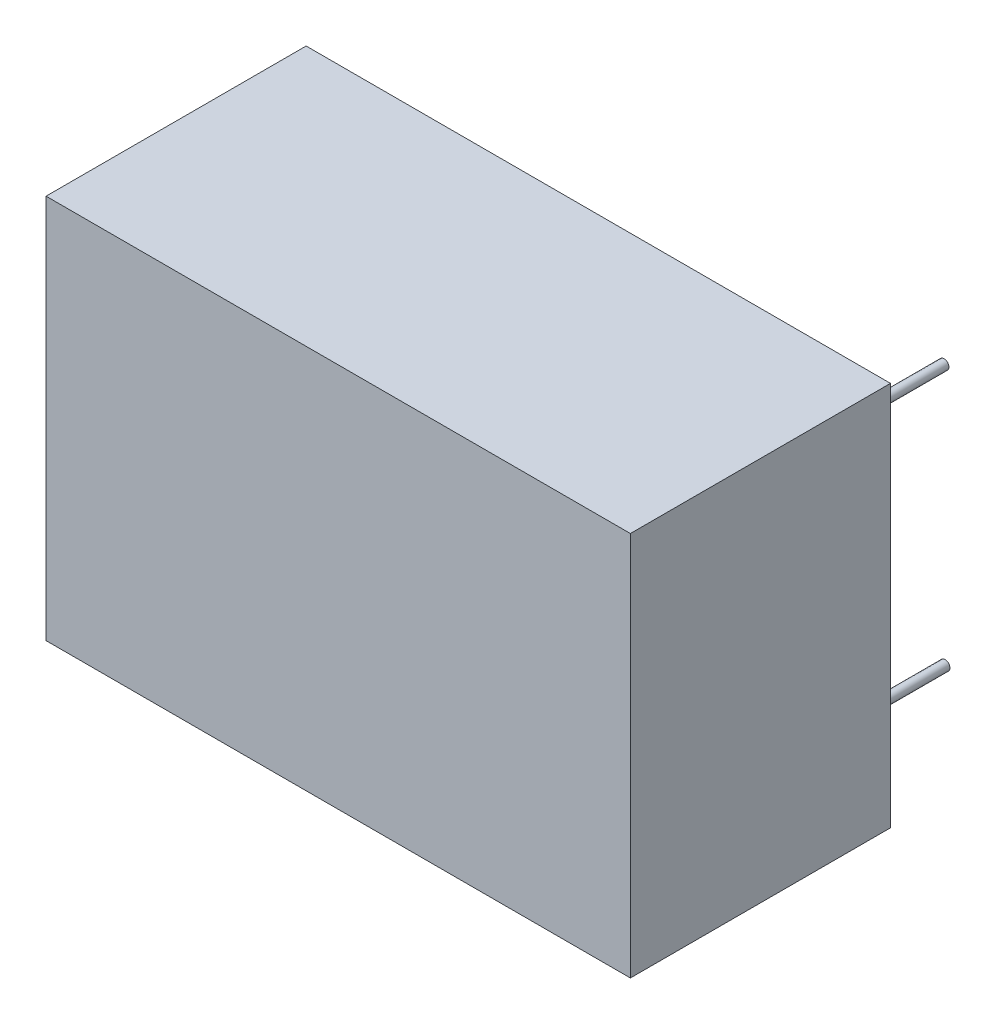
ISO-10303-21;
HEADER;
FILE_DESCRIPTION(('STEP AP214'),'2;1');
FILE_NAME('part.step','',(''),(''),'','','');
FILE_SCHEMA(('AUTOMOTIVE_DESIGN { 1 0 10303 214 1 1 1 1 }'));
ENDSEC;
DATA;
#1=APPLICATION_CONTEXT('core data for automotive mechanical design processes');
#2=APPLICATION_PROTOCOL_DEFINITION('international standard','automotive_design',2000,#1);
#3=PRODUCT_CONTEXT('',#1,'mechanical');
#4=PRODUCT('Part','Part','',(#3));
#5=PRODUCT_RELATED_PRODUCT_CATEGORY('part','',(#4));
#6=PRODUCT_DEFINITION_FORMATION('','',#4);
#7=PRODUCT_DEFINITION_CONTEXT('part definition',#1,'design');
#8=PRODUCT_DEFINITION('design','',#6,#7);
#9=PRODUCT_DEFINITION_SHAPE('','',#8);
#10=(LENGTH_UNIT() NAMED_UNIT(*) SI_UNIT(.MILLI.,.METRE.));
#11=(NAMED_UNIT(*) PLANE_ANGLE_UNIT() SI_UNIT($,.RADIAN.));
#12=(NAMED_UNIT(*) SI_UNIT($,.STERADIAN.) SOLID_ANGLE_UNIT());
#13=UNCERTAINTY_MEASURE_WITH_UNIT(LENGTH_MEASURE(1.E-05),#10,'distance_accuracy_value','');
#14=(GEOMETRIC_REPRESENTATION_CONTEXT(3) GLOBAL_UNCERTAINTY_ASSIGNED_CONTEXT((#13)) GLOBAL_UNIT_ASSIGNED_CONTEXT((#10,
#11,#12)) REPRESENTATION_CONTEXT('',''));
#15=CARTESIAN_POINT('',(0.,0.,0.));
#16=DIRECTION('',(0.,0.,1.));
#17=DIRECTION('',(1.,0.,0.));
#18=AXIS2_PLACEMENT_3D('',#15,#16,#17);
#19=CARTESIAN_POINT('',(-14.05680654724,0.2,-6.));
#20=DIRECTION('',(0.,0.,-1.));
#21=DIRECTION('',(-1.,0.,0.));
#22=AXIS2_PLACEMENT_3D('',#19,#20,#21);
#23=PLANE('',#22);
#24=CARTESIAN_POINT('',(-14.05680654724,0.2,-6.));
#25=DIRECTION('',(0.,0.,1.));
#26=DIRECTION('',(1.,0.,0.));
#27=AXIS2_PLACEMENT_3D('',#24,#25,#26);
#28=CIRCLE('',#27,0.28);
#29=CARTESIAN_POINT('',(-13.77680654724,0.2,-6.));
#30=VERTEX_POINT('',#29);
#31=EDGE_CURVE('E20',#30,#30,#28,.T.);
#32=ORIENTED_EDGE('',*,*,#31,.F.);
#33=EDGE_LOOP('',(#32));
#34=FACE_BOUND('',#33,.T.);
#35=ADVANCED_FACE('F17',(#34),#23,.T.);
#36=CARTESIAN_POINT('',(-14.05680654724,-7.4,-6.));
#37=DIRECTION('',(0.,0.,-1.));
#38=DIRECTION('',(-1.,0.,0.));
#39=AXIS2_PLACEMENT_3D('',#36,#37,#38);
#40=PLANE('',#39);
#41=CARTESIAN_POINT('',(-14.05680654724,-7.4,-6.));
#42=DIRECTION('',(0.,0.,1.));
#43=DIRECTION('',(1.,0.,0.));
#44=AXIS2_PLACEMENT_3D('',#41,#42,#43);
#45=CIRCLE('',#44,0.28);
#46=CARTESIAN_POINT('',(-13.77680654724,-7.4,-6.));
#47=VERTEX_POINT('',#46);
#48=EDGE_CURVE('E98',#47,#47,#45,.T.);
#49=ORIENTED_EDGE('',*,*,#48,.F.);
#50=EDGE_LOOP('',(#49));
#51=FACE_BOUND('',#50,.T.);
#52=ADVANCED_FACE('F108',(#51),#40,.T.);
#53=CARTESIAN_POINT('',(14.,-7.399892433487,-6.));
#54=DIRECTION('',(0.,0.,-1.));
#55=DIRECTION('',(-1.,0.,0.));
#56=AXIS2_PLACEMENT_3D('',#53,#54,#55);
#57=PLANE('',#56);
#58=CARTESIAN_POINT('',(14.,-7.399892433487,-6.));
#59=DIRECTION('',(0.,0.,1.));
#60=DIRECTION('',(1.,0.,0.));
#61=AXIS2_PLACEMENT_3D('',#58,#59,#60);
#62=CIRCLE('',#61,0.28);
#63=CARTESIAN_POINT('',(14.28,-7.399892433487,-6.));
#64=VERTEX_POINT('',#63);
#65=EDGE_CURVE('E96',#64,#64,#62,.T.);
#66=ORIENTED_EDGE('',*,*,#65,.F.);
#67=EDGE_LOOP('',(#66));
#68=FACE_BOUND('',#67,.T.);
#69=ADVANCED_FACE('F113',(#68),#57,.T.);
#70=CARTESIAN_POINT('',(13.943193452751,7.6,-6.));
#71=DIRECTION('',(0.,0.,-1.));
#72=DIRECTION('',(-1.,0.,0.));
#73=AXIS2_PLACEMENT_3D('',#70,#71,#72);
#74=PLANE('',#73);
#75=CARTESIAN_POINT('',(13.943193452751,7.6,-6.));
#76=DIRECTION('',(0.,0.,1.));
#77=DIRECTION('',(1.,0.,0.));
#78=AXIS2_PLACEMENT_3D('',#75,#76,#77);
#79=CIRCLE('',#78,0.28);
#80=CARTESIAN_POINT('',(14.223193452751,7.6,-6.));
#81=VERTEX_POINT('',#80);
#82=EDGE_CURVE('E93',#81,#81,#79,.T.);
#83=ORIENTED_EDGE('',*,*,#82,.F.);
#84=EDGE_LOOP('',(#83));
#85=FACE_BOUND('',#84,.T.);
#86=ADVANCED_FACE('F150',(#85),#74,.T.);
#87=CARTESIAN_POINT('',(-14.05680654724,0.2,-6.));
#88=DIRECTION('',(0.,0.,1.));
#89=DIRECTION('',(1.,0.,0.));
#90=AXIS2_PLACEMENT_3D('',#87,#88,#89);
#91=CYLINDRICAL_SURFACE('',#90,0.28);
#92=CARTESIAN_POINT('',(-14.05680654724,0.2,0.));
#93=DIRECTION('',(0.,0.,1.));
#94=DIRECTION('',(1.,0.,0.));
#95=AXIS2_PLACEMENT_3D('',#92,#93,#94);
#96=CIRCLE('',#95,0.28);
#97=CARTESIAN_POINT('',(-13.77680654724,0.2,0.));
#98=VERTEX_POINT('',#97);
#99=EDGE_CURVE('E90',#98,#98,#96,.T.);
#100=ORIENTED_EDGE('',*,*,#99,.F.);
#101=EDGE_LOOP('',(#100));
#102=FACE_BOUND('',#101,.T.);
#103=ORIENTED_EDGE('',*,*,#31,.T.);
#104=EDGE_LOOP('',(#103));
#105=FACE_BOUND('',#104,.T.);
#106=ADVANCED_FACE('F105',(#102,#105),#91,.T.);
#107=CARTESIAN_POINT('',(-14.05680654724,-7.4,-6.));
#108=DIRECTION('',(0.,0.,1.));
#109=DIRECTION('',(1.,0.,0.));
#110=AXIS2_PLACEMENT_3D('',#107,#108,#109);
#111=CYLINDRICAL_SURFACE('',#110,0.28);
#112=CARTESIAN_POINT('',(-14.05680654724,-7.4,0.));
#113=DIRECTION('',(0.,0.,1.));
#114=DIRECTION('',(1.,0.,0.));
#115=AXIS2_PLACEMENT_3D('',#112,#113,#114);
#116=CIRCLE('',#115,0.28);
#117=CARTESIAN_POINT('',(-13.77680654724,-7.4,0.));
#118=VERTEX_POINT('',#117);
#119=EDGE_CURVE('E87',#118,#118,#116,.T.);
#120=ORIENTED_EDGE('',*,*,#119,.F.);
#121=EDGE_LOOP('',(#120));
#122=FACE_BOUND('',#121,.T.);
#123=ORIENTED_EDGE('',*,*,#48,.T.);
#124=EDGE_LOOP('',(#123));
#125=FACE_BOUND('',#124,.T.);
#126=ADVANCED_FACE('F143',(#122,#125),#111,.T.);
#127=CARTESIAN_POINT('',(14.,-7.399892433487,-6.));
#128=DIRECTION('',(0.,0.,1.));
#129=DIRECTION('',(1.,0.,0.));
#130=AXIS2_PLACEMENT_3D('',#127,#128,#129);
#131=CYLINDRICAL_SURFACE('',#130,0.28);
#132=CARTESIAN_POINT('',(14.,-7.399892433487,0.));
#133=DIRECTION('',(0.,0.,1.));
#134=DIRECTION('',(1.,0.,0.));
#135=AXIS2_PLACEMENT_3D('',#132,#133,#134);
#136=CIRCLE('',#135,0.28);
#137=CARTESIAN_POINT('',(14.28,-7.399892433487,0.));
#138=VERTEX_POINT('',#137);
#139=EDGE_CURVE('E84',#138,#138,#136,.T.);
#140=ORIENTED_EDGE('',*,*,#139,.F.);
#141=EDGE_LOOP('',(#140));
#142=FACE_BOUND('',#141,.T.);
#143=ORIENTED_EDGE('',*,*,#65,.T.);
#144=EDGE_LOOP('',(#143));
#145=FACE_BOUND('',#144,.T.);
#146=ADVANCED_FACE('F139',(#142,#145),#131,.T.);
#147=CARTESIAN_POINT('',(13.943193452751,7.6,-6.));
#148=DIRECTION('',(0.,0.,1.));
#149=DIRECTION('',(1.,0.,0.));
#150=AXIS2_PLACEMENT_3D('',#147,#148,#149);
#151=CYLINDRICAL_SURFACE('',#150,0.28);
#152=CARTESIAN_POINT('',(13.943193452751,7.6,0.));
#153=DIRECTION('',(0.,0.,1.));
#154=DIRECTION('',(1.,0.,0.));
#155=AXIS2_PLACEMENT_3D('',#152,#153,#154);
#156=CIRCLE('',#155,0.28);
#157=CARTESIAN_POINT('',(14.223193452751,7.6,0.));
#158=VERTEX_POINT('',#157);
#159=EDGE_CURVE('E67',#158,#158,#156,.T.);
#160=ORIENTED_EDGE('',*,*,#159,.F.);
#161=EDGE_LOOP('',(#160));
#162=FACE_BOUND('',#161,.T.);
#163=ORIENTED_EDGE('',*,*,#82,.T.);
#164=EDGE_LOOP('',(#163));
#165=FACE_BOUND('',#164,.T.);
#166=ADVANCED_FACE('F136',(#162,#165),#151,.T.);
#167=CARTESIAN_POINT('',(0.,0.,0.));
#168=DIRECTION('',(0.,0.,-1.));
#169=DIRECTION('',(-1.,0.,0.));
#170=AXIS2_PLACEMENT_3D('',#167,#168,#169);
#171=PLANE('',#170);
#172=DIRECTION('',(0.,1.,0.));
#173=VECTOR('',#172,1.);
#174=CARTESIAN_POINT('',(-16.85,-11.1,0.));
#175=LINE('',#174,#173);
#176=CARTESIAN_POINT('',(-16.85,-11.1,0.));
#177=VERTEX_POINT('',#176);
#178=CARTESIAN_POINT('',(-16.85,11.1,0.));
#179=VERTEX_POINT('',#178);
#180=EDGE_CURVE('E55',#177,#179,#175,.T.);
#181=ORIENTED_EDGE('',*,*,#180,.T.);
#182=DIRECTION('',(1.,0.,0.));
#183=VECTOR('',#182,1.);
#184=CARTESIAN_POINT('',(-16.85,11.1,0.));
#185=LINE('',#184,#183);
#186=CARTESIAN_POINT('',(16.85,11.1,0.));
#187=VERTEX_POINT('',#186);
#188=EDGE_CURVE('E256',#179,#187,#185,.T.);
#189=ORIENTED_EDGE('',*,*,#188,.T.);
#190=DIRECTION('',(0.,1.,0.));
#191=VECTOR('',#190,1.);
#192=CARTESIAN_POINT('',(16.85,-11.1,0.));
#193=LINE('',#192,#191);
#194=CARTESIAN_POINT('',(16.85,-11.1,0.));
#195=VERTEX_POINT('',#194);
#196=EDGE_CURVE('E61',#187,#195,#193,.F.);
#197=ORIENTED_EDGE('',*,*,#196,.T.);
#198=DIRECTION('',(1.,0.,0.));
#199=VECTOR('',#198,1.);
#200=CARTESIAN_POINT('',(-16.85,-11.1,0.));
#201=LINE('',#200,#199);
#202=EDGE_CURVE('E58',#195,#177,#201,.F.);
#203=ORIENTED_EDGE('',*,*,#202,.T.);
#204=EDGE_LOOP('',(#181,#189,#197,#203));
#205=FACE_BOUND('',#204,.T.);
#206=ORIENTED_EDGE('',*,*,#159,.T.);
#207=EDGE_LOOP('',(#206));
#208=FACE_BOUND('',#207,.T.);
#209=ORIENTED_EDGE('',*,*,#139,.T.);
#210=EDGE_LOOP('',(#209));
#211=FACE_BOUND('',#210,.T.);
#212=ORIENTED_EDGE('',*,*,#119,.T.);
#213=EDGE_LOOP('',(#212));
#214=FACE_BOUND('',#213,.T.);
#215=ORIENTED_EDGE('',*,*,#99,.T.);
#216=EDGE_LOOP('',(#215));
#217=FACE_BOUND('',#216,.T.);
#218=ADVANCED_FACE('F59',(#205,#208,#211,#214,#217),#171,.T.);
#219=CARTESIAN_POINT('',(-16.85,-11.1,15.));
#220=DIRECTION('',(0.,1.,0.));
#221=DIRECTION('',(0.,0.,1.));
#222=AXIS2_PLACEMENT_3D('',#219,#220,#221);
#223=PLANE('',#222);
#224=DIRECTION('',(0.,0.,1.));
#225=VECTOR('',#224,1.);
#226=CARTESIAN_POINT('',(16.85,-11.1,15.));
#227=LINE('',#226,#225);
#228=CARTESIAN_POINT('',(16.85,-11.1,15.));
#229=VERTEX_POINT('',#228);
#230=EDGE_CURVE('E264',#195,#229,#227,.T.);
#231=ORIENTED_EDGE('',*,*,#230,.T.);
#232=DIRECTION('',(-1.,0.,0.));
#233=VECTOR('',#232,1.);
#234=CARTESIAN_POINT('',(0.,-11.1,15.));
#235=LINE('',#234,#233);
#236=CARTESIAN_POINT('',(-16.85,-11.1,15.));
#237=VERTEX_POINT('',#236);
#238=EDGE_CURVE('E78',#229,#237,#235,.T.);
#239=ORIENTED_EDGE('',*,*,#238,.T.);
#240=DIRECTION('',(0.,0.,-1.));
#241=VECTOR('',#240,1.);
#242=CARTESIAN_POINT('',(-16.85,-11.1,15.));
#243=LINE('',#242,#241);
#244=EDGE_CURVE('E66',#237,#177,#243,.T.);
#245=ORIENTED_EDGE('',*,*,#244,.T.);
#246=ORIENTED_EDGE('',*,*,#202,.F.);
#247=EDGE_LOOP('',(#231,#239,#245,#246));
#248=FACE_BOUND('',#247,.T.);
#249=ADVANCED_FACE('F77',(#248),#223,.F.);
#250=CARTESIAN_POINT('',(-16.85,-11.1,15.));
#251=DIRECTION('',(1.,0.,0.));
#252=DIRECTION('',(0.,0.,-1.));
#253=AXIS2_PLACEMENT_3D('',#250,#251,#252);
#254=PLANE('',#253);
#255=ORIENTED_EDGE('',*,*,#244,.F.);
#256=DIRECTION('',(0.,1.,0.));
#257=VECTOR('',#256,1.);
#258=CARTESIAN_POINT('',(-16.85,0.,15.));
#259=LINE('',#258,#257);
#260=CARTESIAN_POINT('',(-16.85,11.1,15.));
#261=VERTEX_POINT('',#260);
#262=EDGE_CURVE('E257',#237,#261,#259,.T.);
#263=ORIENTED_EDGE('',*,*,#262,.T.);
#264=DIRECTION('',(0.,0.,-1.));
#265=VECTOR('',#264,1.);
#266=CARTESIAN_POINT('',(-16.85,11.1,15.));
#267=LINE('',#266,#265);
#268=EDGE_CURVE('E74',#261,#179,#267,.T.);
#269=ORIENTED_EDGE('',*,*,#268,.T.);
#270=ORIENTED_EDGE('',*,*,#180,.F.);
#271=EDGE_LOOP('',(#255,#263,#269,#270));
#272=FACE_BOUND('',#271,.T.);
#273=ADVANCED_FACE('F71',(#272),#254,.F.);
#274=CARTESIAN_POINT('',(-16.85,11.1,15.));
#275=DIRECTION('',(0.,-1.,0.));
#276=DIRECTION('',(0.,0.,-1.));
#277=AXIS2_PLACEMENT_3D('',#274,#275,#276);
#278=PLANE('',#277);
#279=ORIENTED_EDGE('',*,*,#268,.F.);
#280=DIRECTION('',(-1.,0.,0.));
#281=VECTOR('',#280,1.);
#282=CARTESIAN_POINT('',(0.,11.1,15.));
#283=LINE('',#282,#281);
#284=CARTESIAN_POINT('',(16.85,11.1,15.));
#285=VERTEX_POINT('',#284);
#286=EDGE_CURVE('E26',#261,#285,#283,.F.);
#287=ORIENTED_EDGE('',*,*,#286,.T.);
#288=DIRECTION('',(0.,0.,1.));
#289=VECTOR('',#288,1.);
#290=CARTESIAN_POINT('',(16.85,11.1,15.));
#291=LINE('',#290,#289);
#292=EDGE_CURVE('E34',#285,#187,#291,.F.);
#293=ORIENTED_EDGE('',*,*,#292,.T.);
#294=ORIENTED_EDGE('',*,*,#188,.F.);
#295=EDGE_LOOP('',(#279,#287,#293,#294));
#296=FACE_BOUND('',#295,.T.);
#297=ADVANCED_FACE('F123',(#296),#278,.F.);
#298=CARTESIAN_POINT('',(16.85,-11.1,15.));
#299=DIRECTION('',(-1.,0.,0.));
#300=DIRECTION('',(0.,0.,1.));
#301=AXIS2_PLACEMENT_3D('',#298,#299,#300);
#302=PLANE('',#301);
#303=ORIENTED_EDGE('',*,*,#292,.F.);
#304=DIRECTION('',(0.,1.,0.));
#305=VECTOR('',#304,1.);
#306=CARTESIAN_POINT('',(16.85,0.,15.));
#307=LINE('',#306,#305);
#308=EDGE_CURVE('E11',#285,#229,#307,.F.);
#309=ORIENTED_EDGE('',*,*,#308,.T.);
#310=ORIENTED_EDGE('',*,*,#230,.F.);
#311=ORIENTED_EDGE('',*,*,#196,.F.);
#312=EDGE_LOOP('',(#303,#309,#310,#311));
#313=FACE_BOUND('',#312,.T.);
#314=ADVANCED_FACE('F117',(#313),#302,.F.);
#315=CARTESIAN_POINT('',(0.,0.,15.));
#316=DIRECTION('',(0.,0.,-1.));
#317=DIRECTION('',(-1.,0.,0.));
#318=AXIS2_PLACEMENT_3D('',#315,#316,#317);
#319=PLANE('',#318);
#320=ORIENTED_EDGE('',*,*,#286,.F.);
#321=ORIENTED_EDGE('',*,*,#262,.F.);
#322=ORIENTED_EDGE('',*,*,#238,.F.);
#323=ORIENTED_EDGE('',*,*,#308,.F.);
#324=EDGE_LOOP('',(#320,#321,#322,#323));
#325=FACE_BOUND('',#324,.T.);
#326=ADVANCED_FACE('F115',(#325),#319,.F.);
#327=CLOSED_SHELL('',(#35,#52,#69,#86,#106,#126,#146,#166,#218,#249,#273,#297,#314,#326));
#328=MANIFOLD_SOLID_BREP('B1',#327);
#329=ADVANCED_BREP_SHAPE_REPRESENTATION('',(#18,#328),#14);
#330=SHAPE_DEFINITION_REPRESENTATION(#9,#329);
ENDSEC;
END-ISO-10303-21;
